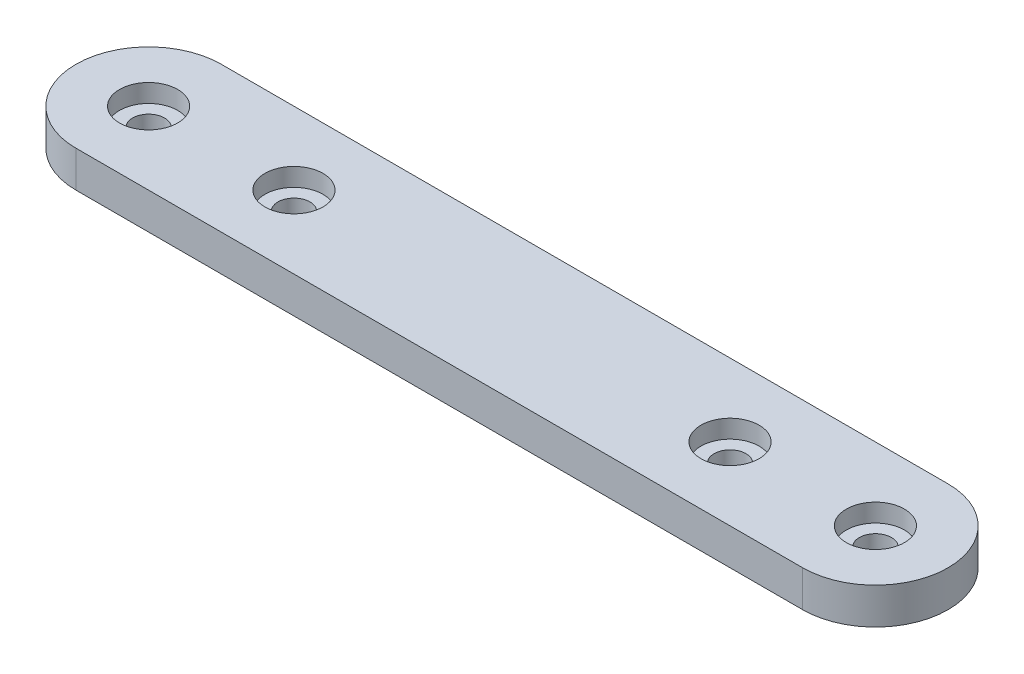
ISO-10303-21;
HEADER;
FILE_DESCRIPTION(('STEP AP214'),'2;1');
FILE_NAME('part.step','',(''),(''),'','','');
FILE_SCHEMA(('AUTOMOTIVE_DESIGN { 1 0 10303 214 1 1 1 1 }'));
ENDSEC;
DATA;
#1=APPLICATION_CONTEXT('core data for automotive mechanical design processes');
#2=APPLICATION_PROTOCOL_DEFINITION('international standard','automotive_design',2000,#1);
#3=PRODUCT_CONTEXT('',#1,'mechanical');
#4=PRODUCT('Part','Part','',(#3));
#5=PRODUCT_RELATED_PRODUCT_CATEGORY('part','',(#4));
#6=PRODUCT_DEFINITION_FORMATION('','',#4);
#7=PRODUCT_DEFINITION_CONTEXT('part definition',#1,'design');
#8=PRODUCT_DEFINITION('design','',#6,#7);
#9=PRODUCT_DEFINITION_SHAPE('','',#8);
#10=(LENGTH_UNIT() NAMED_UNIT(*) SI_UNIT(.MILLI.,.METRE.));
#11=(NAMED_UNIT(*) PLANE_ANGLE_UNIT() SI_UNIT($,.RADIAN.));
#12=(NAMED_UNIT(*) SI_UNIT($,.STERADIAN.) SOLID_ANGLE_UNIT());
#13=UNCERTAINTY_MEASURE_WITH_UNIT(LENGTH_MEASURE(1.E-05),#10,'distance_accuracy_value','');
#14=(GEOMETRIC_REPRESENTATION_CONTEXT(3) GLOBAL_UNCERTAINTY_ASSIGNED_CONTEXT((#13)) GLOBAL_UNIT_ASSIGNED_CONTEXT((#10,
#11,#12)) REPRESENTATION_CONTEXT('',''));
#15=CARTESIAN_POINT('',(0.,0.,0.));
#16=DIRECTION('',(0.,0.,1.));
#17=DIRECTION('',(1.,0.,0.));
#18=AXIS2_PLACEMENT_3D('',#15,#16,#17);
#19=CARTESIAN_POINT('',(0.,6.35,0.));
#20=DIRECTION('',(0.,-1.,0.));
#21=DIRECTION('',(0.,0.,-1.));
#22=AXIS2_PLACEMENT_3D('',#19,#20,#21);
#23=CYLINDRICAL_SURFACE('',#22,2.794);
#24=CARTESIAN_POINT('',(0.,0.,0.));
#25=DIRECTION('',(0.,1.,0.));
#26=DIRECTION('',(0.,0.,1.));
#27=AXIS2_PLACEMENT_3D('',#24,#25,#26);
#28=CIRCLE('',#27,2.794);
#29=CARTESIAN_POINT('',(0.,0.,2.794));
#30=VERTEX_POINT('',#29);
#31=EDGE_CURVE('E114',#30,#30,#28,.T.);
#32=ORIENTED_EDGE('',*,*,#31,.F.);
#33=EDGE_LOOP('',(#32));
#34=FACE_BOUND('',#33,.T.);
#35=CARTESIAN_POINT('',(0.,3.175,0.));
#36=DIRECTION('',(0.,1.,0.));
#37=DIRECTION('',(0.,0.,1.));
#38=AXIS2_PLACEMENT_3D('',#35,#36,#37);
#39=CIRCLE('',#38,2.794);
#40=CARTESIAN_POINT('',(0.,3.175,2.794));
#41=VERTEX_POINT('',#40);
#42=EDGE_CURVE('E42',#41,#41,#39,.T.);
#43=ORIENTED_EDGE('',*,*,#42,.T.);
#44=EDGE_LOOP('',(#43));
#45=FACE_BOUND('',#44,.T.);
#46=ADVANCED_FACE('F38',(#34,#45),#23,.F.);
#47=CARTESIAN_POINT('',(127.,6.35,0.));
#48=DIRECTION('',(0.,-1.,0.));
#49=DIRECTION('',(0.,0.,-1.));
#50=AXIS2_PLACEMENT_3D('',#47,#48,#49);
#51=CYLINDRICAL_SURFACE('',#50,2.81351507634001);
#52=CARTESIAN_POINT('',(127.,0.,0.));
#53=DIRECTION('',(0.,1.,0.));
#54=DIRECTION('',(0.,0.,1.));
#55=AXIS2_PLACEMENT_3D('',#52,#53,#54);
#56=CIRCLE('',#55,2.81351507634001);
#57=CARTESIAN_POINT('',(127.,0.,2.81351507634001));
#58=VERTEX_POINT('',#57);
#59=EDGE_CURVE('E151',#58,#58,#56,.T.);
#60=ORIENTED_EDGE('',*,*,#59,.F.);
#61=EDGE_LOOP('',(#60));
#62=FACE_BOUND('',#61,.T.);
#63=CARTESIAN_POINT('',(127.,3.175,0.));
#64=DIRECTION('',(0.,1.,0.));
#65=DIRECTION('',(0.,0.,1.));
#66=AXIS2_PLACEMENT_3D('',#63,#64,#65);
#67=CIRCLE('',#66,2.81351507634001);
#68=CARTESIAN_POINT('',(127.,3.175,2.81351507634001));
#69=VERTEX_POINT('',#68);
#70=EDGE_CURVE('E133',#69,#69,#67,.T.);
#71=ORIENTED_EDGE('',*,*,#70,.T.);
#72=EDGE_LOOP('',(#71));
#73=FACE_BOUND('',#72,.T.);
#74=ADVANCED_FACE('F167',(#62,#73),#51,.F.);
#75=CARTESIAN_POINT('',(101.6,-7.90262538654088,0.));
#76=DIRECTION('',(0.,1.,0.));
#77=DIRECTION('',(0.,0.,1.));
#78=AXIS2_PLACEMENT_3D('',#75,#76,#77);
#79=CYLINDRICAL_SURFACE('',#78,2.79400000000001);
#80=CARTESIAN_POINT('',(101.6,0.,0.));
#81=DIRECTION('',(0.,1.,0.));
#82=DIRECTION('',(0.,0.,1.));
#83=AXIS2_PLACEMENT_3D('',#80,#81,#82);
#84=CIRCLE('',#83,2.79400000000001);
#85=CARTESIAN_POINT('',(101.6,0.,2.79400000000001));
#86=VERTEX_POINT('',#85);
#87=EDGE_CURVE('E140',#86,#86,#84,.F.);
#88=CARTESIAN_POINT('',(101.6,3.175,0.));
#89=DIRECTION('',(0.,1.,0.));
#90=DIRECTION('',(0.,0.,1.));
#91=AXIS2_PLACEMENT_3D('',#88,#89,#90);
#92=CIRCLE('',#91,2.79400000000001);
#93=CARTESIAN_POINT('',(101.6,3.175,2.79400000000001));
#94=VERTEX_POINT('',#93);
#95=EDGE_CURVE('E129',#94,#94,#92,.F.);
#96=CARTESIAN_POINT('',(101.6,0.,2.79400000000001));
#97=CARTESIAN_POINT('',(101.6,0.0330729166666665,2.79400000000001));
#98=CARTESIAN_POINT('',(101.6,0.066145833333333,2.79400000000001));
#99=CARTESIAN_POINT('',(101.6,0.132291666666666,2.79400000000001));
#100=CARTESIAN_POINT('',(101.6,0.165364583333332,2.79400000000001));
#101=CARTESIAN_POINT('',(101.6,0.231510416666666,2.79400000000001));
#102=CARTESIAN_POINT('',(101.6,0.264583333333333,2.79400000000001));
#103=CARTESIAN_POINT('',(101.6,0.330729166666667,2.79400000000001));
#104=CARTESIAN_POINT('',(101.6,0.363802083333333,2.79400000000001));
#105=CARTESIAN_POINT('',(101.6,0.429947916666666,2.79400000000001));
#106=CARTESIAN_POINT('',(101.6,0.463020833333333,2.79400000000001));
#107=CARTESIAN_POINT('',(101.6,0.529166666666666,2.79400000000001));
#108=CARTESIAN_POINT('',(101.6,0.562239583333333,2.79400000000001));
#109=CARTESIAN_POINT('',(101.6,0.628385416666667,2.79400000000001));
#110=CARTESIAN_POINT('',(101.6,0.661458333333333,2.79400000000001));
#111=CARTESIAN_POINT('',(101.6,0.727604166666666,2.79400000000001));
#112=CARTESIAN_POINT('',(101.6,0.760677083333333,2.79400000000001));
#113=CARTESIAN_POINT('',(101.6,0.826822916666666,2.79400000000001));
#114=CARTESIAN_POINT('',(101.6,0.859895833333332,2.79400000000001));
#115=CARTESIAN_POINT('',(101.6,0.926041666666665,2.79400000000001));
#116=CARTESIAN_POINT('',(101.6,0.959114583333332,2.79400000000001));
#117=CARTESIAN_POINT('',(101.6,1.02526041666667,2.79400000000001));
#118=CARTESIAN_POINT('',(101.6,1.05833333333333,2.79400000000001));
#119=CARTESIAN_POINT('',(101.6,1.12447916666667,2.79400000000001));
#120=CARTESIAN_POINT('',(101.6,1.15755208333333,2.79400000000001));
#121=CARTESIAN_POINT('',(101.6,1.22369791666667,2.79400000000001));
#122=CARTESIAN_POINT('',(101.6,1.25677083333333,2.79400000000001));
#123=CARTESIAN_POINT('',(101.6,1.32291666666667,2.79400000000001));
#124=CARTESIAN_POINT('',(101.6,1.35598958333333,2.79400000000001));
#125=CARTESIAN_POINT('',(101.6,1.42213541666667,2.79400000000001));
#126=CARTESIAN_POINT('',(101.6,1.45520833333333,2.79400000000001));
#127=CARTESIAN_POINT('',(101.6,1.52135416666667,2.79400000000001));
#128=CARTESIAN_POINT('',(101.6,1.55442708333333,2.79400000000001));
#129=CARTESIAN_POINT('',(101.6,1.62057291666667,2.79400000000001));
#130=CARTESIAN_POINT('',(101.6,1.65364583333333,2.79400000000001));
#131=CARTESIAN_POINT('',(101.6,1.71979166666666,2.79400000000001));
#132=CARTESIAN_POINT('',(101.6,1.75286458333333,2.79400000000001));
#133=CARTESIAN_POINT('',(101.6,1.81901041666666,2.79400000000001));
#134=CARTESIAN_POINT('',(101.6,1.85208333333333,2.79400000000001));
#135=CARTESIAN_POINT('',(101.6,1.91822916666667,2.79400000000001));
#136=CARTESIAN_POINT('',(101.6,1.95130208333333,2.79400000000001));
#137=CARTESIAN_POINT('',(101.6,2.01744791666667,2.79400000000001));
#138=CARTESIAN_POINT('',(101.6,2.05052083333333,2.79400000000001));
#139=CARTESIAN_POINT('',(101.6,2.11666666666666,2.79400000000001));
#140=CARTESIAN_POINT('',(101.6,2.14973958333333,2.79400000000001));
#141=CARTESIAN_POINT('',(101.6,2.21588541666667,2.79400000000001));
#142=CARTESIAN_POINT('',(101.6,2.24895833333333,2.79400000000001));
#143=CARTESIAN_POINT('',(101.6,2.31510416666667,2.79400000000001));
#144=CARTESIAN_POINT('',(101.6,2.34817708333333,2.79400000000001));
#145=CARTESIAN_POINT('',(101.6,2.41432291666666,2.79400000000001));
#146=CARTESIAN_POINT('',(101.6,2.44739583333333,2.79400000000001));
#147=CARTESIAN_POINT('',(101.6,2.51354166666666,2.79400000000001));
#148=CARTESIAN_POINT('',(101.6,2.54661458333333,2.79400000000001));
#149=CARTESIAN_POINT('',(101.6,2.61276041666666,2.79400000000001));
#150=CARTESIAN_POINT('',(101.6,2.64583333333333,2.79400000000001));
#151=CARTESIAN_POINT('',(101.6,2.71197916666666,2.79400000000001));
#152=CARTESIAN_POINT('',(101.6,2.74505208333333,2.79400000000001));
#153=CARTESIAN_POINT('',(101.6,2.81119791666666,2.79400000000001));
#154=CARTESIAN_POINT('',(101.6,2.84427083333333,2.79400000000001));
#155=CARTESIAN_POINT('',(101.6,2.91041666666666,2.79400000000001));
#156=CARTESIAN_POINT('',(101.6,2.94348958333333,2.79400000000001));
#157=CARTESIAN_POINT('',(101.6,3.00963541666667,2.79400000000001));
#158=CARTESIAN_POINT('',(101.6,3.04270833333333,2.79400000000001));
#159=CARTESIAN_POINT('',(101.6,3.10885416666666,2.79400000000001));
#160=CARTESIAN_POINT('',(101.6,3.14192708333333,2.79400000000001));
#161=CARTESIAN_POINT('',(101.6,3.175,2.79400000000001));
#162=B_SPLINE_CURVE_WITH_KNOTS('',3,(#96,#97,#98,#99,#100,#101,#102,#103,#104,#105,#106,#107,
#108,#109,#110,#111,#112,#113,#114,#115,#116,#117,#118,#119,#120,#121,#122,#123,#124,#125,#126,
#127,#128,#129,#130,#131,#132,#133,#134,#135,#136,#137,#138,#139,#140,#141,#142,#143,#144,#145,
#146,#147,#148,#149,#150,#151,#152,#153,#154,#155,#156,#157,#158,#159,#160,#161),.UNSPECIFIED.,
.F.,.F.,(4,2,2,2,2,2,2,2,2,2,2,2,2,2,2,2,2,2,2,2,2,2,2,2,2,2,2,2,2,2,2,2,4),(0.,
0.0992187499999995,0.198437499999999,0.29765625,0.396875,0.496093749999999,0.5953125,0.69453125,
0.793749999999999,0.892968749999999,0.992187499999998,1.09140625,1.190625,1.28984375,1.3890625,
1.48828125,1.5875,1.68671875,1.7859375,1.88515625,1.984375,2.08359375,2.1828125,2.28203125,
2.38125,2.48046875,2.5796875,2.67890625,2.778125,2.87734375,2.9765625,3.07578125,3.175),.UNSPECIFIED.);
#163=EDGE_CURVE('BSEAM173',#86,#94,#162,.T.);
#164=ORIENTED_EDGE('',*,*,#87,.T.);
#165=ORIENTED_EDGE('',*,*,#95,.F.);
#166=ORIENTED_EDGE('',*,*,#163,.T.);
#167=ORIENTED_EDGE('',*,*,#163,.F.);
#168=EDGE_LOOP('',(#164,#166,#165,#167));
#169=FACE_BOUND('',#168,.T.);
#170=ADVANCED_FACE('F173',(#169),#79,.F.);
#171=CARTESIAN_POINT('',(25.4,-7.90262538654088,0.));
#172=DIRECTION('',(0.,1.,0.));
#173=DIRECTION('',(0.,0.,1.));
#174=AXIS2_PLACEMENT_3D('',#171,#172,#173);
#175=CYLINDRICAL_SURFACE('',#174,2.794);
#176=CARTESIAN_POINT('',(25.4,0.,0.));
#177=DIRECTION('',(0.,1.,0.));
#178=DIRECTION('',(0.,0.,1.));
#179=AXIS2_PLACEMENT_3D('',#176,#177,#178);
#180=CIRCLE('',#179,2.794);
#181=CARTESIAN_POINT('',(25.4,0.,2.794));
#182=VERTEX_POINT('',#181);
#183=EDGE_CURVE('E145',#182,#182,#180,.F.);
#184=CARTESIAN_POINT('',(25.4,3.175,0.));
#185=DIRECTION('',(0.,1.,0.));
#186=DIRECTION('',(0.,0.,1.));
#187=AXIS2_PLACEMENT_3D('',#184,#185,#186);
#188=CIRCLE('',#187,2.794);
#189=CARTESIAN_POINT('',(25.4,3.175,2.794));
#190=VERTEX_POINT('',#189);
#191=EDGE_CURVE('E125',#190,#190,#188,.F.);
#192=CARTESIAN_POINT('',(25.4,0.,2.794));
#193=CARTESIAN_POINT('',(25.4,0.0330729166666665,2.794));
#194=CARTESIAN_POINT('',(25.4,0.066145833333333,2.794));
#195=CARTESIAN_POINT('',(25.4,0.132291666666666,2.794));
#196=CARTESIAN_POINT('',(25.4,0.165364583333332,2.794));
#197=CARTESIAN_POINT('',(25.4,0.231510416666666,2.794));
#198=CARTESIAN_POINT('',(25.4,0.264583333333333,2.794));
#199=CARTESIAN_POINT('',(25.4,0.330729166666667,2.794));
#200=CARTESIAN_POINT('',(25.4,0.363802083333333,2.794));
#201=CARTESIAN_POINT('',(25.4,0.429947916666666,2.794));
#202=CARTESIAN_POINT('',(25.4,0.463020833333333,2.794));
#203=CARTESIAN_POINT('',(25.4,0.529166666666666,2.794));
#204=CARTESIAN_POINT('',(25.4,0.562239583333333,2.794));
#205=CARTESIAN_POINT('',(25.4,0.628385416666667,2.794));
#206=CARTESIAN_POINT('',(25.4,0.661458333333333,2.794));
#207=CARTESIAN_POINT('',(25.4,0.727604166666666,2.794));
#208=CARTESIAN_POINT('',(25.4,0.760677083333333,2.794));
#209=CARTESIAN_POINT('',(25.4,0.826822916666666,2.794));
#210=CARTESIAN_POINT('',(25.4,0.859895833333332,2.794));
#211=CARTESIAN_POINT('',(25.4,0.926041666666665,2.794));
#212=CARTESIAN_POINT('',(25.4,0.959114583333332,2.794));
#213=CARTESIAN_POINT('',(25.4,1.02526041666667,2.794));
#214=CARTESIAN_POINT('',(25.4,1.05833333333333,2.794));
#215=CARTESIAN_POINT('',(25.4,1.12447916666667,2.794));
#216=CARTESIAN_POINT('',(25.4,1.15755208333333,2.794));
#217=CARTESIAN_POINT('',(25.4,1.22369791666667,2.794));
#218=CARTESIAN_POINT('',(25.4,1.25677083333333,2.794));
#219=CARTESIAN_POINT('',(25.4,1.32291666666667,2.794));
#220=CARTESIAN_POINT('',(25.4,1.35598958333333,2.794));
#221=CARTESIAN_POINT('',(25.4,1.42213541666667,2.794));
#222=CARTESIAN_POINT('',(25.4,1.45520833333333,2.794));
#223=CARTESIAN_POINT('',(25.4,1.52135416666667,2.794));
#224=CARTESIAN_POINT('',(25.4,1.55442708333333,2.794));
#225=CARTESIAN_POINT('',(25.4,1.62057291666667,2.794));
#226=CARTESIAN_POINT('',(25.4,1.65364583333333,2.794));
#227=CARTESIAN_POINT('',(25.4,1.71979166666666,2.794));
#228=CARTESIAN_POINT('',(25.4,1.75286458333333,2.794));
#229=CARTESIAN_POINT('',(25.4,1.81901041666666,2.794));
#230=CARTESIAN_POINT('',(25.4,1.85208333333333,2.794));
#231=CARTESIAN_POINT('',(25.4,1.91822916666667,2.794));
#232=CARTESIAN_POINT('',(25.4,1.95130208333333,2.794));
#233=CARTESIAN_POINT('',(25.4,2.01744791666667,2.794));
#234=CARTESIAN_POINT('',(25.4,2.05052083333333,2.794));
#235=CARTESIAN_POINT('',(25.4,2.11666666666666,2.794));
#236=CARTESIAN_POINT('',(25.4,2.14973958333333,2.794));
#237=CARTESIAN_POINT('',(25.4,2.21588541666667,2.794));
#238=CARTESIAN_POINT('',(25.4,2.24895833333333,2.794));
#239=CARTESIAN_POINT('',(25.4,2.31510416666667,2.794));
#240=CARTESIAN_POINT('',(25.4,2.34817708333333,2.794));
#241=CARTESIAN_POINT('',(25.4,2.41432291666666,2.794));
#242=CARTESIAN_POINT('',(25.4,2.44739583333333,2.794));
#243=CARTESIAN_POINT('',(25.4,2.51354166666666,2.794));
#244=CARTESIAN_POINT('',(25.4,2.54661458333333,2.794));
#245=CARTESIAN_POINT('',(25.4,2.61276041666666,2.794));
#246=CARTESIAN_POINT('',(25.4,2.64583333333333,2.794));
#247=CARTESIAN_POINT('',(25.4,2.71197916666666,2.794));
#248=CARTESIAN_POINT('',(25.4,2.74505208333333,2.794));
#249=CARTESIAN_POINT('',(25.4,2.81119791666666,2.794));
#250=CARTESIAN_POINT('',(25.4,2.84427083333333,2.794));
#251=CARTESIAN_POINT('',(25.4,2.91041666666666,2.794));
#252=CARTESIAN_POINT('',(25.4,2.94348958333333,2.794));
#253=CARTESIAN_POINT('',(25.4,3.00963541666667,2.794));
#254=CARTESIAN_POINT('',(25.4,3.04270833333333,2.794));
#255=CARTESIAN_POINT('',(25.4,3.10885416666666,2.794));
#256=CARTESIAN_POINT('',(25.4,3.14192708333333,2.794));
#257=CARTESIAN_POINT('',(25.4,3.175,2.794));
#258=B_SPLINE_CURVE_WITH_KNOTS('',3,(#192,#193,#194,#195,#196,#197,#198,#199,#200,#201,#202,
#203,#204,#205,#206,#207,#208,#209,#210,#211,#212,#213,#214,#215,#216,#217,#218,#219,#220,#221,
#222,#223,#224,#225,#226,#227,#228,#229,#230,#231,#232,#233,#234,#235,#236,#237,#238,#239,#240,
#241,#242,#243,#244,#245,#246,#247,#248,#249,#250,#251,#252,#253,#254,#255,#256,#257),
.UNSPECIFIED.,.F.,.F.,(4,2,2,2,2,2,2,2,2,2,2,2,2,2,2,2,2,2,2,2,2,2,2,2,2,2,2,2,2,2,2,2,4),(0.,
0.0992187499999995,0.198437499999999,0.29765625,0.396875,0.496093749999999,0.5953125,0.69453125,
0.793749999999999,0.892968749999999,0.992187499999998,1.09140625,1.190625,1.28984375,1.3890625,
1.48828125,1.5875,1.68671875,1.7859375,1.88515625,1.984375,2.08359375,2.1828125,2.28203125,
2.38125,2.48046875,2.5796875,2.67890625,2.778125,2.87734375,2.9765625,3.07578125,3.175),.UNSPECIFIED.);
#259=EDGE_CURVE('BSEAM180',#182,#190,#258,.T.);
#260=ORIENTED_EDGE('',*,*,#183,.T.);
#261=ORIENTED_EDGE('',*,*,#191,.F.);
#262=ORIENTED_EDGE('',*,*,#259,.T.);
#263=ORIENTED_EDGE('',*,*,#259,.F.);
#264=EDGE_LOOP('',(#260,#262,#261,#263));
#265=FACE_BOUND('',#264,.T.);
#266=ADVANCED_FACE('F180',(#265),#175,.F.);
#267=CARTESIAN_POINT('',(0.,6.35,0.));
#268=DIRECTION('',(0.,1.,0.));
#269=DIRECTION('',(0.,0.,1.));
#270=AXIS2_PLACEMENT_3D('',#267,#268,#269);
#271=PLANE('',#270);
#272=CARTESIAN_POINT('',(0.,6.35,0.));
#273=DIRECTION('',(0.,1.,0.));
#274=DIRECTION('',(0.,0.,1.));
#275=AXIS2_PLACEMENT_3D('',#272,#273,#274);
#276=CIRCLE('',#275,5.08);
#277=CARTESIAN_POINT('',(0.,6.35,5.08));
#278=VERTEX_POINT('',#277);
#279=EDGE_CURVE('E347',#278,#278,#276,.T.);
#280=ORIENTED_EDGE('',*,*,#279,.F.);
#281=EDGE_LOOP('',(#280));
#282=FACE_BOUND('',#281,.T.);
#283=CARTESIAN_POINT('',(101.6,6.35,0.));
#284=DIRECTION('',(0.,1.,0.));
#285=DIRECTION('',(0.,0.,1.));
#286=AXIS2_PLACEMENT_3D('',#283,#284,#285);
#287=CIRCLE('',#286,5.08);
#288=CARTESIAN_POINT('',(101.6,6.35,5.08));
#289=VERTEX_POINT('',#288);
#290=EDGE_CURVE('E359',#289,#289,#287,.T.);
#291=ORIENTED_EDGE('',*,*,#290,.F.);
#292=EDGE_LOOP('',(#291));
#293=FACE_BOUND('',#292,.T.);
#294=CARTESIAN_POINT('',(25.4,6.35,0.));
#295=DIRECTION('',(0.,1.,0.));
#296=DIRECTION('',(0.,0.,1.));
#297=AXIS2_PLACEMENT_3D('',#294,#295,#296);
#298=CIRCLE('',#297,5.08);
#299=CARTESIAN_POINT('',(25.4,6.35,5.08));
#300=VERTEX_POINT('',#299);
#301=EDGE_CURVE('E358',#300,#300,#298,.T.);
#302=ORIENTED_EDGE('',*,*,#301,.F.);
#303=EDGE_LOOP('',(#302));
#304=FACE_BOUND('',#303,.T.);
#305=CARTESIAN_POINT('',(127.,6.35,0.));
#306=DIRECTION('',(0.,1.,0.));
#307=DIRECTION('',(0.,0.,1.));
#308=AXIS2_PLACEMENT_3D('',#305,#306,#307);
#309=CIRCLE('',#308,5.07999999999999);
#310=CARTESIAN_POINT('',(127.,6.35,5.07999999999999));
#311=VERTEX_POINT('',#310);
#312=EDGE_CURVE('E366',#311,#311,#309,.T.);
#313=ORIENTED_EDGE('',*,*,#312,.F.);
#314=EDGE_LOOP('',(#313));
#315=FACE_BOUND('',#314,.T.);
#316=CARTESIAN_POINT('',(0.,6.35,0.));
#317=DIRECTION('',(0.,1.,0.));
#318=DIRECTION('',(0.,0.,1.));
#319=AXIS2_PLACEMENT_3D('',#316,#317,#318);
#320=CIRCLE('',#319,12.7);
#321=CARTESIAN_POINT('',(0.,6.35,-12.7));
#322=VERTEX_POINT('',#321);
#323=CARTESIAN_POINT('',(0.,6.35,12.7));
#324=VERTEX_POINT('',#323);
#325=EDGE_CURVE('E93',#322,#324,#320,.T.);
#326=ORIENTED_EDGE('',*,*,#325,.T.);
#327=DIRECTION('',(1.,0.,0.));
#328=VECTOR('',#327,1.);
#329=CARTESIAN_POINT('',(0.,6.35,12.7));
#330=LINE('',#329,#328);
#331=CARTESIAN_POINT('',(127.,6.35,12.7));
#332=VERTEX_POINT('',#331);
#333=EDGE_CURVE('E88',#324,#332,#330,.T.);
#334=ORIENTED_EDGE('',*,*,#333,.T.);
#335=CARTESIAN_POINT('',(127.,6.35,0.));
#336=DIRECTION('',(0.,1.,0.));
#337=DIRECTION('',(0.,0.,1.));
#338=AXIS2_PLACEMENT_3D('',#335,#336,#337);
#339=CIRCLE('',#338,12.7);
#340=CARTESIAN_POINT('',(127.,6.35,-12.7));
#341=VERTEX_POINT('',#340);
#342=EDGE_CURVE('E91',#332,#341,#339,.T.);
#343=ORIENTED_EDGE('',*,*,#342,.T.);
#344=DIRECTION('',(-1.,0.,0.));
#345=VECTOR('',#344,1.);
#346=CARTESIAN_POINT('',(0.,6.35,-12.7));
#347=LINE('',#346,#345);
#348=EDGE_CURVE('E58',#341,#322,#347,.T.);
#349=ORIENTED_EDGE('',*,*,#348,.T.);
#350=EDGE_LOOP('',(#326,#334,#343,#349));
#351=FACE_BOUND('',#350,.T.);
#352=ADVANCED_FACE('F89',(#282,#293,#304,#315,#351),#271,.T.);
#353=CARTESIAN_POINT('',(0.,0.,0.));
#354=DIRECTION('',(0.,1.,0.));
#355=DIRECTION('',(0.,0.,1.));
#356=AXIS2_PLACEMENT_3D('',#353,#354,#355);
#357=PLANE('',#356);
#358=ORIENTED_EDGE('',*,*,#183,.F.);
#359=EDGE_LOOP('',(#358));
#360=FACE_BOUND('',#359,.T.);
#361=ORIENTED_EDGE('',*,*,#87,.F.);
#362=EDGE_LOOP('',(#361));
#363=FACE_BOUND('',#362,.T.);
#364=CARTESIAN_POINT('',(0.,0.,0.));
#365=DIRECTION('',(0.,1.,0.));
#366=DIRECTION('',(0.,0.,1.));
#367=AXIS2_PLACEMENT_3D('',#364,#365,#366);
#368=CIRCLE('',#367,12.7);
#369=CARTESIAN_POINT('',(0.,0.,-12.7));
#370=VERTEX_POINT('',#369);
#371=CARTESIAN_POINT('',(0.,0.,12.7));
#372=VERTEX_POINT('',#371);
#373=EDGE_CURVE('E110',#370,#372,#368,.T.);
#374=ORIENTED_EDGE('',*,*,#373,.F.);
#375=DIRECTION('',(-1.,0.,0.));
#376=VECTOR('',#375,1.);
#377=CARTESIAN_POINT('',(0.,0.,-12.7));
#378=LINE('',#377,#376);
#379=CARTESIAN_POINT('',(127.,0.,-12.7));
#380=VERTEX_POINT('',#379);
#381=EDGE_CURVE('E81',#380,#370,#378,.T.);
#382=ORIENTED_EDGE('',*,*,#381,.F.);
#383=CARTESIAN_POINT('',(127.,0.,0.));
#384=DIRECTION('',(0.,1.,0.));
#385=DIRECTION('',(0.,0.,1.));
#386=AXIS2_PLACEMENT_3D('',#383,#384,#385);
#387=CIRCLE('',#386,12.7);
#388=CARTESIAN_POINT('',(127.,0.,12.7));
#389=VERTEX_POINT('',#388);
#390=EDGE_CURVE('E75',#389,#380,#387,.T.);
#391=ORIENTED_EDGE('',*,*,#390,.F.);
#392=DIRECTION('',(1.,0.,0.));
#393=VECTOR('',#392,1.);
#394=CARTESIAN_POINT('',(0.,0.,12.7));
#395=LINE('',#394,#393);
#396=EDGE_CURVE('E98',#372,#389,#395,.T.);
#397=ORIENTED_EDGE('',*,*,#396,.F.);
#398=EDGE_LOOP('',(#374,#382,#391,#397));
#399=FACE_BOUND('',#398,.T.);
#400=ORIENTED_EDGE('',*,*,#31,.T.);
#401=EDGE_LOOP('',(#400));
#402=FACE_BOUND('',#401,.T.);
#403=ORIENTED_EDGE('',*,*,#59,.T.);
#404=EDGE_LOOP('',(#403));
#405=FACE_BOUND('',#404,.T.);
#406=ADVANCED_FACE('F163',(#360,#363,#399,#402,#405),#357,.F.);
#407=CARTESIAN_POINT('',(0.,6.35,0.));
#408=DIRECTION('',(0.,-1.,0.));
#409=DIRECTION('',(0.,0.,-1.));
#410=AXIS2_PLACEMENT_3D('',#407,#408,#409);
#411=CYLINDRICAL_SURFACE('',#410,12.7);
#412=ORIENTED_EDGE('',*,*,#373,.T.);
#413=DIRECTION('',(0.,-1.,0.));
#414=VECTOR('',#413,1.);
#415=CARTESIAN_POINT('',(0.,6.35,12.7));
#416=LINE('',#415,#414);
#417=EDGE_CURVE('E11',#324,#372,#416,.T.);
#418=ORIENTED_EDGE('',*,*,#417,.F.);
#419=ORIENTED_EDGE('',*,*,#325,.F.);
#420=DIRECTION('',(0.,-1.,0.));
#421=VECTOR('',#420,1.);
#422=CARTESIAN_POINT('',(0.,6.35,-12.7));
#423=LINE('',#422,#421);
#424=EDGE_CURVE('E106',#322,#370,#423,.T.);
#425=ORIENTED_EDGE('',*,*,#424,.T.);
#426=EDGE_LOOP('',(#412,#418,#419,#425));
#427=FACE_BOUND('',#426,.T.);
#428=ADVANCED_FACE('F40',(#427),#411,.T.);
#429=CARTESIAN_POINT('',(0.,6.35,12.7));
#430=DIRECTION('',(0.,0.,-1.));
#431=DIRECTION('',(-1.,0.,0.));
#432=AXIS2_PLACEMENT_3D('',#429,#430,#431);
#433=PLANE('',#432);
#434=ORIENTED_EDGE('',*,*,#396,.T.);
#435=DIRECTION('',(0.,-1.,0.));
#436=VECTOR('',#435,1.);
#437=CARTESIAN_POINT('',(127.,6.35,12.7));
#438=LINE('',#437,#436);
#439=EDGE_CURVE('E49',#332,#389,#438,.T.);
#440=ORIENTED_EDGE('',*,*,#439,.F.);
#441=ORIENTED_EDGE('',*,*,#333,.F.);
#442=ORIENTED_EDGE('',*,*,#417,.T.);
#443=EDGE_LOOP('',(#434,#440,#441,#442));
#444=FACE_BOUND('',#443,.T.);
#445=ADVANCED_FACE('F97',(#444),#433,.F.);
#446=CARTESIAN_POINT('',(127.,6.35,0.));
#447=DIRECTION('',(0.,-1.,0.));
#448=DIRECTION('',(0.,0.,-1.));
#449=AXIS2_PLACEMENT_3D('',#446,#447,#448);
#450=CYLINDRICAL_SURFACE('',#449,12.7);
#451=ORIENTED_EDGE('',*,*,#390,.T.);
#452=DIRECTION('',(0.,-1.,0.));
#453=VECTOR('',#452,1.);
#454=CARTESIAN_POINT('',(127.,6.35,-12.7));
#455=LINE('',#454,#453);
#456=EDGE_CURVE('E100',#341,#380,#455,.T.);
#457=ORIENTED_EDGE('',*,*,#456,.F.);
#458=ORIENTED_EDGE('',*,*,#342,.F.);
#459=ORIENTED_EDGE('',*,*,#439,.T.);
#460=EDGE_LOOP('',(#451,#457,#458,#459));
#461=FACE_BOUND('',#460,.T.);
#462=ADVANCED_FACE('F102',(#461),#450,.T.);
#463=CARTESIAN_POINT('',(0.,6.35,-12.7));
#464=DIRECTION('',(0.,0.,1.));
#465=DIRECTION('',(1.,0.,0.));
#466=AXIS2_PLACEMENT_3D('',#463,#464,#465);
#467=PLANE('',#466);
#468=ORIENTED_EDGE('',*,*,#381,.T.);
#469=ORIENTED_EDGE('',*,*,#424,.F.);
#470=ORIENTED_EDGE('',*,*,#348,.F.);
#471=ORIENTED_EDGE('',*,*,#456,.T.);
#472=EDGE_LOOP('',(#468,#469,#470,#471));
#473=FACE_BOUND('',#472,.T.);
#474=ADVANCED_FACE('F184',(#473),#467,.F.);
#475=CARTESIAN_POINT('',(25.4,3.175,0.));
#476=DIRECTION('',(0.,1.,0.));
#477=DIRECTION('',(0.,0.,1.));
#478=AXIS2_PLACEMENT_3D('',#475,#476,#477);
#479=PLANE('',#478);
#480=CARTESIAN_POINT('',(25.4,3.175,0.));
#481=DIRECTION('',(0.,1.,0.));
#482=DIRECTION('',(0.,0.,1.));
#483=AXIS2_PLACEMENT_3D('',#480,#481,#482);
#484=CIRCLE('',#483,5.08);
#485=CARTESIAN_POINT('',(25.4,3.175,5.08));
#486=VERTEX_POINT('',#485);
#487=EDGE_CURVE('E370',#486,#486,#484,.T.);
#488=ORIENTED_EDGE('',*,*,#487,.T.);
#489=EDGE_LOOP('',(#488));
#490=FACE_BOUND('',#489,.T.);
#491=ORIENTED_EDGE('',*,*,#191,.T.);
#492=EDGE_LOOP('',(#491));
#493=FACE_BOUND('',#492,.T.);
#494=ADVANCED_FACE('F187',(#490,#493),#479,.T.);
#495=CARTESIAN_POINT('',(25.4,3.175,0.));
#496=DIRECTION('',(0.,1.,0.));
#497=DIRECTION('',(0.,0.,1.));
#498=AXIS2_PLACEMENT_3D('',#495,#496,#497);
#499=CYLINDRICAL_SURFACE('',#498,5.08);
#500=ORIENTED_EDGE('',*,*,#487,.F.);
#501=EDGE_LOOP('',(#500));
#502=FACE_BOUND('',#501,.T.);
#503=ORIENTED_EDGE('',*,*,#301,.T.);
#504=EDGE_LOOP('',(#503));
#505=FACE_BOUND('',#504,.T.);
#506=ADVANCED_FACE('F223',(#502,#505),#499,.F.);
#507=CARTESIAN_POINT('',(101.6,3.175,0.));
#508=DIRECTION('',(0.,1.,0.));
#509=DIRECTION('',(0.,0.,1.));
#510=AXIS2_PLACEMENT_3D('',#507,#508,#509);
#511=PLANE('',#510);
#512=CARTESIAN_POINT('',(101.6,3.175,0.));
#513=DIRECTION('',(0.,1.,0.));
#514=DIRECTION('',(0.,0.,1.));
#515=AXIS2_PLACEMENT_3D('',#512,#513,#514);
#516=CIRCLE('',#515,5.08);
#517=CARTESIAN_POINT('',(101.6,3.175,5.08));
#518=VERTEX_POINT('',#517);
#519=EDGE_CURVE('E354',#518,#518,#516,.T.);
#520=ORIENTED_EDGE('',*,*,#519,.T.);
#521=EDGE_LOOP('',(#520));
#522=FACE_BOUND('',#521,.T.);
#523=ORIENTED_EDGE('',*,*,#95,.T.);
#524=EDGE_LOOP('',(#523));
#525=FACE_BOUND('',#524,.T.);
#526=ADVANCED_FACE('F233',(#522,#525),#511,.T.);
#527=CARTESIAN_POINT('',(101.6,3.175,0.));
#528=DIRECTION('',(0.,1.,0.));
#529=DIRECTION('',(0.,0.,1.));
#530=AXIS2_PLACEMENT_3D('',#527,#528,#529);
#531=CYLINDRICAL_SURFACE('',#530,5.08);
#532=ORIENTED_EDGE('',*,*,#519,.F.);
#533=EDGE_LOOP('',(#532));
#534=FACE_BOUND('',#533,.T.);
#535=ORIENTED_EDGE('',*,*,#290,.T.);
#536=EDGE_LOOP('',(#535));
#537=FACE_BOUND('',#536,.T.);
#538=ADVANCED_FACE('F243',(#534,#537),#531,.F.);
#539=CARTESIAN_POINT('',(127.,3.175,0.));
#540=DIRECTION('',(0.,1.,0.));
#541=DIRECTION('',(0.,0.,1.));
#542=AXIS2_PLACEMENT_3D('',#539,#540,#541);
#543=CYLINDRICAL_SURFACE('',#542,5.07999999999999);
#544=CARTESIAN_POINT('',(127.,3.175,0.));
#545=DIRECTION('',(0.,1.,0.));
#546=DIRECTION('',(0.,0.,1.));
#547=AXIS2_PLACEMENT_3D('',#544,#545,#546);
#548=CIRCLE('',#547,5.07999999999999);
#549=CARTESIAN_POINT('',(127.,3.175,5.07999999999999));
#550=VERTEX_POINT('',#549);
#551=EDGE_CURVE('E351',#550,#550,#548,.T.);
#552=ORIENTED_EDGE('',*,*,#551,.F.);
#553=EDGE_LOOP('',(#552));
#554=FACE_BOUND('',#553,.T.);
#555=ORIENTED_EDGE('',*,*,#312,.T.);
#556=EDGE_LOOP('',(#555));
#557=FACE_BOUND('',#556,.T.);
#558=ADVANCED_FACE('F253',(#554,#557),#543,.F.);
#559=CARTESIAN_POINT('',(127.,3.175,0.));
#560=DIRECTION('',(0.,1.,0.));
#561=DIRECTION('',(0.,0.,1.));
#562=AXIS2_PLACEMENT_3D('',#559,#560,#561);
#563=PLANE('',#562);
#564=ORIENTED_EDGE('',*,*,#70,.F.);
#565=EDGE_LOOP('',(#564));
#566=FACE_BOUND('',#565,.T.);
#567=ORIENTED_EDGE('',*,*,#551,.T.);
#568=EDGE_LOOP('',(#567));
#569=FACE_BOUND('',#568,.T.);
#570=ADVANCED_FACE('F263',(#566,#569),#563,.T.);
#571=CARTESIAN_POINT('',(0.,3.175,0.));
#572=DIRECTION('',(0.,1.,0.));
#573=DIRECTION('',(0.,0.,1.));
#574=AXIS2_PLACEMENT_3D('',#571,#572,#573);
#575=CYLINDRICAL_SURFACE('',#574,5.08);
#576=CARTESIAN_POINT('',(0.,3.175,0.));
#577=DIRECTION('',(0.,1.,0.));
#578=DIRECTION('',(0.,0.,1.));
#579=AXIS2_PLACEMENT_3D('',#576,#577,#578);
#580=CIRCLE('',#579,5.08);
#581=CARTESIAN_POINT('',(0.,3.175,5.08));
#582=VERTEX_POINT('',#581);
#583=EDGE_CURVE('E130',#582,#582,#580,.T.);
#584=ORIENTED_EDGE('',*,*,#583,.F.);
#585=EDGE_LOOP('',(#584));
#586=FACE_BOUND('',#585,.T.);
#587=ORIENTED_EDGE('',*,*,#279,.T.);
#588=EDGE_LOOP('',(#587));
#589=FACE_BOUND('',#588,.T.);
#590=ADVANCED_FACE('F273',(#586,#589),#575,.F.);
#591=CARTESIAN_POINT('',(0.,3.175,0.));
#592=DIRECTION('',(0.,1.,0.));
#593=DIRECTION('',(0.,0.,1.));
#594=AXIS2_PLACEMENT_3D('',#591,#592,#593);
#595=PLANE('',#594);
#596=ORIENTED_EDGE('',*,*,#42,.F.);
#597=EDGE_LOOP('',(#596));
#598=FACE_BOUND('',#597,.T.);
#599=ORIENTED_EDGE('',*,*,#583,.T.);
#600=EDGE_LOOP('',(#599));
#601=FACE_BOUND('',#600,.T.);
#602=ADVANCED_FACE('F283',(#598,#601),#595,.T.);
#603=CLOSED_SHELL('',(#46,#74,#170,#266,#352,#406,#428,#445,#462,#474,#494,#506,#526,#538,#558,
#570,#590,#602));
#604=MANIFOLD_SOLID_BREP('B2',#603);
#605=ADVANCED_BREP_SHAPE_REPRESENTATION('',(#18,#604),#14);
#606=SHAPE_DEFINITION_REPRESENTATION(#9,#605);
ENDSEC;
END-ISO-10303-21;
